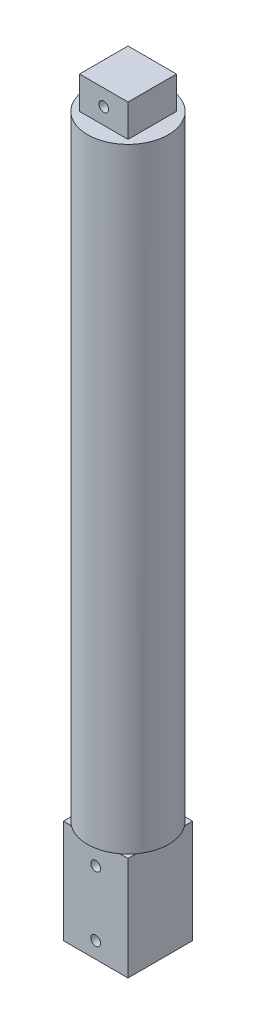
ISO-10303-21;
HEADER;
FILE_DESCRIPTION(('STEP AP214'),'2;1');
FILE_NAME('part.step','',(''),(''),'','','');
FILE_SCHEMA(('AUTOMOTIVE_DESIGN { 1 0 10303 214 1 1 1 1 }'));
ENDSEC;
DATA;
#1=APPLICATION_CONTEXT('core data for automotive mechanical design processes');
#2=APPLICATION_PROTOCOL_DEFINITION('international standard','automotive_design',2000,#1);
#3=PRODUCT_CONTEXT('',#1,'mechanical');
#4=PRODUCT('Part','Part','',(#3));
#5=PRODUCT_RELATED_PRODUCT_CATEGORY('part','',(#4));
#6=PRODUCT_DEFINITION_FORMATION('','',#4);
#7=PRODUCT_DEFINITION_CONTEXT('part definition',#1,'design');
#8=PRODUCT_DEFINITION('design','',#6,#7);
#9=PRODUCT_DEFINITION_SHAPE('','',#8);
#10=(LENGTH_UNIT() NAMED_UNIT(*) SI_UNIT(.MILLI.,.METRE.));
#11=(NAMED_UNIT(*) PLANE_ANGLE_UNIT() SI_UNIT($,.RADIAN.));
#12=(NAMED_UNIT(*) SI_UNIT($,.STERADIAN.) SOLID_ANGLE_UNIT());
#13=UNCERTAINTY_MEASURE_WITH_UNIT(LENGTH_MEASURE(1.E-05),#10,'distance_accuracy_value','');
#14=(GEOMETRIC_REPRESENTATION_CONTEXT(3) GLOBAL_UNCERTAINTY_ASSIGNED_CONTEXT((#13)) GLOBAL_UNIT_ASSIGNED_CONTEXT((#10,
#11,#12)) REPRESENTATION_CONTEXT('',''));
#15=CARTESIAN_POINT('',(0.,0.,0.));
#16=DIRECTION('',(0.,0.,1.));
#17=DIRECTION('',(1.,0.,0.));
#18=AXIS2_PLACEMENT_3D('',#15,#16,#17);
#19=CARTESIAN_POINT('',(0.,232.,0.));
#20=DIRECTION('',(0.,-1.,0.));
#21=DIRECTION('',(0.,0.,-1.));
#22=AXIS2_PLACEMENT_3D('',#19,#20,#21);
#23=CYLINDRICAL_SURFACE('',#22,12.5);
#24=CARTESIAN_POINT('',(0.,32.,0.));
#25=DIRECTION('',(0.,1.,0.));
#26=DIRECTION('',(0.,0.,1.));
#27=AXIS2_PLACEMENT_3D('',#24,#25,#26);
#28=CIRCLE('',#27,12.5);
#29=CARTESIAN_POINT('',(7.5,32.,10.));
#30=VERTEX_POINT('',#29);
#31=CARTESIAN_POINT('',(10.,32.,7.50000000000001));
#32=VERTEX_POINT('',#31);
#33=EDGE_CURVE('E172',#30,#32,#28,.T.);
#34=ORIENTED_EDGE('',*,*,#33,.T.);
#35=CARTESIAN_POINT('',(10.,32.,-7.50000000000001));
#36=VERTEX_POINT('',#35);
#37=EDGE_CURVE('E49',#32,#36,#28,.T.);
#38=ORIENTED_EDGE('',*,*,#37,.T.);
#39=CARTESIAN_POINT('',(7.5,32.,-10.));
#40=VERTEX_POINT('',#39);
#41=EDGE_CURVE('E12',#36,#40,#28,.T.);
#42=ORIENTED_EDGE('',*,*,#41,.T.);
#43=CARTESIAN_POINT('',(-7.5,32.,-10.));
#44=VERTEX_POINT('',#43);
#45=EDGE_CURVE('E236',#40,#44,#28,.T.);
#46=ORIENTED_EDGE('',*,*,#45,.T.);
#47=CARTESIAN_POINT('',(-10.,32.,-7.5));
#48=VERTEX_POINT('',#47);
#49=EDGE_CURVE('E47',#44,#48,#28,.T.);
#50=ORIENTED_EDGE('',*,*,#49,.T.);
#51=CARTESIAN_POINT('',(-10.,32.,7.5));
#52=VERTEX_POINT('',#51);
#53=EDGE_CURVE('E231',#48,#52,#28,.T.);
#54=ORIENTED_EDGE('',*,*,#53,.T.);
#55=CARTESIAN_POINT('',(-7.5,32.,10.));
#56=VERTEX_POINT('',#55);
#57=EDGE_CURVE('E177',#52,#56,#28,.T.);
#58=ORIENTED_EDGE('',*,*,#57,.T.);
#59=EDGE_CURVE('E176',#56,#30,#28,.T.);
#60=ORIENTED_EDGE('',*,*,#59,.T.);
#61=EDGE_LOOP('',(#34,#38,#42,#46,#50,#54,#58,#60));
#62=FACE_BOUND('',#61,.T.);
#63=CARTESIAN_POINT('',(0.,222.,0.));
#64=DIRECTION('',(0.,1.,0.));
#65=DIRECTION('',(0.,0.,1.));
#66=AXIS2_PLACEMENT_3D('',#63,#64,#65);
#67=CIRCLE('',#66,12.5);
#68=CARTESIAN_POINT('',(0.,222.,12.5));
#69=VERTEX_POINT('',#68);
#70=EDGE_CURVE('E169',#69,#69,#67,.T.);
#71=ORIENTED_EDGE('',*,*,#70,.F.);
#72=EDGE_LOOP('',(#71));
#73=FACE_BOUND('',#72,.T.);
#74=ADVANCED_FACE('F38',(#62,#73),#23,.T.);
#75=CARTESIAN_POINT('',(-10.,32.,10.));
#76=DIRECTION('',(0.,-1.,0.));
#77=DIRECTION('',(0.,0.,-1.));
#78=AXIS2_PLACEMENT_3D('',#75,#76,#77);
#79=PLANE('',#78);
#80=ORIENTED_EDGE('',*,*,#33,.F.);
#81=DIRECTION('',(-1.,0.,0.));
#82=VECTOR('',#81,1.);
#83=CARTESIAN_POINT('',(-10.,32.,10.));
#84=LINE('',#83,#82);
#85=CARTESIAN_POINT('',(10.,32.,10.));
#86=VERTEX_POINT('',#85);
#87=EDGE_CURVE('E199',#86,#30,#84,.T.);
#88=ORIENTED_EDGE('',*,*,#87,.F.);
#89=DIRECTION('',(0.,0.,-1.));
#90=VECTOR('',#89,1.);
#91=CARTESIAN_POINT('',(10.,32.,10.));
#92=LINE('',#91,#90);
#93=EDGE_CURVE('E219',#86,#32,#92,.T.);
#94=ORIENTED_EDGE('',*,*,#93,.T.);
#95=EDGE_LOOP('',(#80,#88,#94));
#96=FACE_BOUND('',#95,.T.);
#97=ADVANCED_FACE('F284',(#96),#79,.F.);
#98=ORIENTED_EDGE('',*,*,#41,.F.);
#99=CARTESIAN_POINT('',(10.,32.,-10.));
#100=VERTEX_POINT('',#99);
#101=EDGE_CURVE('E217',#36,#100,#92,.T.);
#102=ORIENTED_EDGE('',*,*,#101,.T.);
#103=DIRECTION('',(-1.,0.,0.));
#104=VECTOR('',#103,1.);
#105=CARTESIAN_POINT('',(-10.,32.,-10.));
#106=LINE('',#105,#104);
#107=EDGE_CURVE('E194',#100,#40,#106,.T.);
#108=ORIENTED_EDGE('',*,*,#107,.T.);
#109=EDGE_LOOP('',(#98,#102,#108));
#110=FACE_BOUND('',#109,.T.);
#111=ADVANCED_FACE('F249',(#110),#79,.F.);
#112=ORIENTED_EDGE('',*,*,#49,.F.);
#113=CARTESIAN_POINT('',(-10.,32.,-10.));
#114=VERTEX_POINT('',#113);
#115=EDGE_CURVE('E211',#44,#114,#106,.T.);
#116=ORIENTED_EDGE('',*,*,#115,.T.);
#117=DIRECTION('',(0.,0.,-1.));
#118=VECTOR('',#117,1.);
#119=CARTESIAN_POINT('',(-10.,32.,10.));
#120=LINE('',#119,#118);
#121=EDGE_CURVE('E202',#48,#114,#120,.T.);
#122=ORIENTED_EDGE('',*,*,#121,.F.);
#123=EDGE_LOOP('',(#112,#116,#122));
#124=FACE_BOUND('',#123,.T.);
#125=ADVANCED_FACE('F264',(#124),#79,.F.);
#126=CARTESIAN_POINT('',(0.,0.,10.));
#127=DIRECTION('',(0.,0.,1.));
#128=DIRECTION('',(1.,0.,0.));
#129=AXIS2_PLACEMENT_3D('',#126,#127,#128);
#130=PLANE('',#129);
#131=CARTESIAN_POINT('',(0.,5.,10.));
#132=DIRECTION('',(0.,0.,1.));
#133=DIRECTION('',(1.,0.,0.));
#134=AXIS2_PLACEMENT_3D('',#131,#132,#133);
#135=CIRCLE('',#134,1.5);
#136=CARTESIAN_POINT('',(1.5,5.,10.));
#137=VERTEX_POINT('',#136);
#138=EDGE_CURVE('E184',#137,#137,#135,.T.);
#139=ORIENTED_EDGE('',*,*,#138,.F.);
#140=EDGE_LOOP('',(#139));
#141=FACE_BOUND('',#140,.T.);
#142=DIRECTION('',(0.,-1.,0.));
#143=VECTOR('',#142,1.);
#144=CARTESIAN_POINT('',(-10.,32.,10.));
#145=LINE('',#144,#143);
#146=CARTESIAN_POINT('',(-10.,32.,10.));
#147=VERTEX_POINT('',#146);
#148=CARTESIAN_POINT('',(-10.,0.,10.));
#149=VERTEX_POINT('',#148);
#150=EDGE_CURVE('E190',#147,#149,#145,.T.);
#151=ORIENTED_EDGE('',*,*,#150,.T.);
#152=DIRECTION('',(1.,0.,0.));
#153=VECTOR('',#152,1.);
#154=CARTESIAN_POINT('',(-10.,0.,10.));
#155=LINE('',#154,#153);
#156=CARTESIAN_POINT('',(10.,0.,10.));
#157=VERTEX_POINT('',#156);
#158=EDGE_CURVE('E193',#149,#157,#155,.T.);
#159=ORIENTED_EDGE('',*,*,#158,.T.);
#160=DIRECTION('',(0.,1.,0.));
#161=VECTOR('',#160,1.);
#162=CARTESIAN_POINT('',(10.,32.,10.));
#163=LINE('',#162,#161);
#164=EDGE_CURVE('E196',#157,#86,#163,.T.);
#165=ORIENTED_EDGE('',*,*,#164,.T.);
#166=ORIENTED_EDGE('',*,*,#87,.T.);
#167=EDGE_CURVE('E203',#30,#56,#84,.T.);
#168=ORIENTED_EDGE('',*,*,#167,.T.);
#169=EDGE_CURVE('E198',#56,#147,#84,.T.);
#170=ORIENTED_EDGE('',*,*,#169,.T.);
#171=EDGE_LOOP('',(#151,#159,#165,#166,#168,#170));
#172=FACE_BOUND('',#171,.T.);
#173=CARTESIAN_POINT('',(0.,25.,10.));
#174=DIRECTION('',(0.,0.,1.));
#175=DIRECTION('',(1.,0.,0.));
#176=AXIS2_PLACEMENT_3D('',#173,#174,#175);
#177=CIRCLE('',#176,1.5);
#178=CARTESIAN_POINT('',(1.5,25.,10.));
#179=VERTEX_POINT('',#178);
#180=EDGE_CURVE('E178',#179,#179,#177,.T.);
#181=ORIENTED_EDGE('',*,*,#180,.F.);
#182=EDGE_LOOP('',(#181));
#183=FACE_BOUND('',#182,.T.);
#184=ADVANCED_FACE('F280',(#141,#172,#183),#130,.T.);
#185=CARTESIAN_POINT('',(0.,0.,-10.));
#186=DIRECTION('',(0.,0.,1.));
#187=DIRECTION('',(1.,0.,0.));
#188=AXIS2_PLACEMENT_3D('',#185,#186,#187);
#189=PLANE('',#188);
#190=DIRECTION('',(0.,-1.,0.));
#191=VECTOR('',#190,1.);
#192=CARTESIAN_POINT('',(-10.,32.,-10.));
#193=LINE('',#192,#191);
#194=CARTESIAN_POINT('',(-10.,0.,-10.));
#195=VERTEX_POINT('',#194);
#196=EDGE_CURVE('E187',#114,#195,#193,.T.);
#197=ORIENTED_EDGE('',*,*,#196,.F.);
#198=ORIENTED_EDGE('',*,*,#115,.F.);
#199=EDGE_CURVE('E213',#40,#44,#106,.T.);
#200=ORIENTED_EDGE('',*,*,#199,.F.);
#201=ORIENTED_EDGE('',*,*,#107,.F.);
#202=DIRECTION('',(0.,1.,0.));
#203=VECTOR('',#202,1.);
#204=CARTESIAN_POINT('',(10.,32.,-10.));
#205=LINE('',#204,#203);
#206=CARTESIAN_POINT('',(10.,0.,-10.));
#207=VERTEX_POINT('',#206);
#208=EDGE_CURVE('E208',#207,#100,#205,.T.);
#209=ORIENTED_EDGE('',*,*,#208,.F.);
#210=DIRECTION('',(1.,0.,0.));
#211=VECTOR('',#210,1.);
#212=CARTESIAN_POINT('',(-10.,0.,-10.));
#213=LINE('',#212,#211);
#214=EDGE_CURVE('E206',#195,#207,#213,.T.);
#215=ORIENTED_EDGE('',*,*,#214,.F.);
#216=EDGE_LOOP('',(#197,#198,#200,#201,#209,#215));
#217=FACE_BOUND('',#216,.T.);
#218=CARTESIAN_POINT('',(0.,5.,-10.));
#219=DIRECTION('',(0.,0.,1.));
#220=DIRECTION('',(1.,0.,0.));
#221=AXIS2_PLACEMENT_3D('',#218,#219,#220);
#222=CIRCLE('',#221,1.5);
#223=CARTESIAN_POINT('',(1.5,5.,-10.));
#224=VERTEX_POINT('',#223);
#225=EDGE_CURVE('E181',#224,#224,#222,.T.);
#226=ORIENTED_EDGE('',*,*,#225,.T.);
#227=EDGE_LOOP('',(#226));
#228=FACE_BOUND('',#227,.T.);
#229=CARTESIAN_POINT('',(0.,25.,-10.));
#230=DIRECTION('',(0.,0.,1.));
#231=DIRECTION('',(1.,0.,0.));
#232=AXIS2_PLACEMENT_3D('',#229,#230,#231);
#233=CIRCLE('',#232,1.5);
#234=CARTESIAN_POINT('',(1.5,25.,-10.));
#235=VERTEX_POINT('',#234);
#236=EDGE_CURVE('E175',#235,#235,#233,.T.);
#237=ORIENTED_EDGE('',*,*,#236,.T.);
#238=EDGE_LOOP('',(#237));
#239=FACE_BOUND('',#238,.T.);
#240=ADVANCED_FACE('F257',(#217,#228,#239),#189,.F.);
#241=CARTESIAN_POINT('',(-10.,32.,10.));
#242=DIRECTION('',(1.,0.,0.));
#243=DIRECTION('',(0.,1.,0.));
#244=AXIS2_PLACEMENT_3D('',#241,#242,#243);
#245=PLANE('',#244);
#246=ORIENTED_EDGE('',*,*,#196,.T.);
#247=DIRECTION('',(0.,0.,-1.));
#248=VECTOR('',#247,1.);
#249=CARTESIAN_POINT('',(-10.,0.,10.));
#250=LINE('',#249,#248);
#251=EDGE_CURVE('E226',#149,#195,#250,.T.);
#252=ORIENTED_EDGE('',*,*,#251,.F.);
#253=ORIENTED_EDGE('',*,*,#150,.F.);
#254=EDGE_CURVE('E214',#147,#52,#120,.T.);
#255=ORIENTED_EDGE('',*,*,#254,.T.);
#256=EDGE_CURVE('E218',#52,#48,#120,.T.);
#257=ORIENTED_EDGE('',*,*,#256,.T.);
#258=ORIENTED_EDGE('',*,*,#121,.T.);
#259=EDGE_LOOP('',(#246,#252,#253,#255,#257,#258));
#260=FACE_BOUND('',#259,.T.);
#261=ADVANCED_FACE('F40',(#260),#245,.F.);
#262=CARTESIAN_POINT('',(-10.,0.,10.));
#263=DIRECTION('',(0.,1.,0.));
#264=DIRECTION('',(-1.,0.,0.));
#265=AXIS2_PLACEMENT_3D('',#262,#263,#264);
#266=PLANE('',#265);
#267=ORIENTED_EDGE('',*,*,#214,.T.);
#268=DIRECTION('',(0.,0.,-1.));
#269=VECTOR('',#268,1.);
#270=CARTESIAN_POINT('',(10.,0.,10.));
#271=LINE('',#270,#269);
#272=EDGE_CURVE('E222',#157,#207,#271,.T.);
#273=ORIENTED_EDGE('',*,*,#272,.F.);
#274=ORIENTED_EDGE('',*,*,#158,.F.);
#275=ORIENTED_EDGE('',*,*,#251,.T.);
#276=EDGE_LOOP('',(#267,#273,#274,#275));
#277=FACE_BOUND('',#276,.T.);
#278=ADVANCED_FACE('F303',(#277),#266,.F.);
#279=CARTESIAN_POINT('',(10.,32.,10.));
#280=DIRECTION('',(-1.,0.,0.));
#281=DIRECTION('',(0.,-1.,0.));
#282=AXIS2_PLACEMENT_3D('',#279,#280,#281);
#283=PLANE('',#282);
#284=ORIENTED_EDGE('',*,*,#208,.T.);
#285=ORIENTED_EDGE('',*,*,#101,.F.);
#286=EDGE_CURVE('E223',#32,#36,#92,.T.);
#287=ORIENTED_EDGE('',*,*,#286,.F.);
#288=ORIENTED_EDGE('',*,*,#93,.F.);
#289=ORIENTED_EDGE('',*,*,#164,.F.);
#290=ORIENTED_EDGE('',*,*,#272,.T.);
#291=EDGE_LOOP('',(#284,#285,#287,#288,#289,#290));
#292=FACE_BOUND('',#291,.T.);
#293=ADVANCED_FACE('F252',(#292),#283,.F.);
#294=ORIENTED_EDGE('',*,*,#57,.F.);
#295=ORIENTED_EDGE('',*,*,#254,.F.);
#296=ORIENTED_EDGE('',*,*,#169,.F.);
#297=EDGE_LOOP('',(#294,#295,#296));
#298=FACE_BOUND('',#297,.T.);
#299=ADVANCED_FACE('F275',(#298),#79,.F.);
#300=CARTESIAN_POINT('',(0.,5.,10.));
#301=DIRECTION('',(0.,0.,-1.));
#302=DIRECTION('',(-1.,0.,0.));
#303=AXIS2_PLACEMENT_3D('',#300,#301,#302);
#304=CYLINDRICAL_SURFACE('',#303,1.5);
#305=ORIENTED_EDGE('',*,*,#138,.T.);
#306=EDGE_LOOP('',(#305));
#307=FACE_BOUND('',#306,.T.);
#308=ORIENTED_EDGE('',*,*,#225,.F.);
#309=EDGE_LOOP('',(#308));
#310=FACE_BOUND('',#309,.T.);
#311=ADVANCED_FACE('F295',(#307,#310),#304,.F.);
#312=CARTESIAN_POINT('',(0.,25.,10.));
#313=DIRECTION('',(0.,0.,-1.));
#314=DIRECTION('',(-1.,0.,0.));
#315=AXIS2_PLACEMENT_3D('',#312,#313,#314);
#316=CYLINDRICAL_SURFACE('',#315,1.5);
#317=ORIENTED_EDGE('',*,*,#180,.T.);
#318=EDGE_LOOP('',(#317));
#319=FACE_BOUND('',#318,.T.);
#320=ORIENTED_EDGE('',*,*,#236,.F.);
#321=EDGE_LOOP('',(#320));
#322=FACE_BOUND('',#321,.T.);
#323=ADVANCED_FACE('F300',(#319,#322),#316,.F.);
#324=CARTESIAN_POINT('',(0.,32.,0.));
#325=DIRECTION('',(0.,1.,0.));
#326=DIRECTION('',(0.,0.,1.));
#327=AXIS2_PLACEMENT_3D('',#324,#325,#326);
#328=PLANE('',#327);
#329=ORIENTED_EDGE('',*,*,#45,.F.);
#330=ORIENTED_EDGE('',*,*,#199,.T.);
#331=EDGE_LOOP('',(#329,#330));
#332=FACE_BOUND('',#331,.T.);
#333=ADVANCED_FACE('F316',(#332),#328,.F.);
#334=ORIENTED_EDGE('',*,*,#256,.F.);
#335=ORIENTED_EDGE('',*,*,#53,.F.);
#336=EDGE_LOOP('',(#334,#335));
#337=FACE_BOUND('',#336,.T.);
#338=ADVANCED_FACE('F272',(#337),#328,.F.);
#339=ORIENTED_EDGE('',*,*,#37,.F.);
#340=ORIENTED_EDGE('',*,*,#286,.T.);
#341=EDGE_LOOP('',(#339,#340));
#342=FACE_BOUND('',#341,.T.);
#343=ADVANCED_FACE('F246',(#342),#328,.F.);
#344=ORIENTED_EDGE('',*,*,#167,.F.);
#345=ORIENTED_EDGE('',*,*,#59,.F.);
#346=EDGE_LOOP('',(#344,#345));
#347=FACE_BOUND('',#346,.T.);
#348=ADVANCED_FACE('F279',(#347),#328,.F.);
#349=CARTESIAN_POINT('',(0.,222.,0.));
#350=DIRECTION('',(0.,1.,0.));
#351=DIRECTION('',(0.,0.,1.));
#352=AXIS2_PLACEMENT_3D('',#349,#350,#351);
#353=PLANE('',#352);
#354=DIRECTION('',(1.,0.,0.));
#355=VECTOR('',#354,1.);
#356=CARTESIAN_POINT('',(-7.5,222.,7.5));
#357=LINE('',#356,#355);
#358=CARTESIAN_POINT('',(-7.5,222.,7.5));
#359=VERTEX_POINT('',#358);
#360=CARTESIAN_POINT('',(7.5,222.,7.5));
#361=VERTEX_POINT('',#360);
#362=EDGE_CURVE('E141',#359,#361,#357,.T.);
#363=ORIENTED_EDGE('',*,*,#362,.F.);
#364=DIRECTION('',(0.,0.,1.));
#365=VECTOR('',#364,1.);
#366=CARTESIAN_POINT('',(-7.5,222.,-7.5));
#367=LINE('',#366,#365);
#368=CARTESIAN_POINT('',(-7.5,222.,-7.5));
#369=VERTEX_POINT('',#368);
#370=EDGE_CURVE('E151',#369,#359,#367,.T.);
#371=ORIENTED_EDGE('',*,*,#370,.F.);
#372=DIRECTION('',(-1.,0.,0.));
#373=VECTOR('',#372,1.);
#374=CARTESIAN_POINT('',(-7.5,222.,-7.5));
#375=LINE('',#374,#373);
#376=CARTESIAN_POINT('',(7.5,222.,-7.5));
#377=VERTEX_POINT('',#376);
#378=EDGE_CURVE('E133',#377,#369,#375,.T.);
#379=ORIENTED_EDGE('',*,*,#378,.F.);
#380=DIRECTION('',(0.,0.,-1.));
#381=VECTOR('',#380,1.);
#382=CARTESIAN_POINT('',(7.5,222.,-7.5));
#383=LINE('',#382,#381);
#384=EDGE_CURVE('E148',#361,#377,#383,.T.);
#385=ORIENTED_EDGE('',*,*,#384,.F.);
#386=EDGE_LOOP('',(#363,#371,#379,#385));
#387=FACE_BOUND('',#386,.T.);
#388=ORIENTED_EDGE('',*,*,#70,.T.);
#389=EDGE_LOOP('',(#388));
#390=FACE_BOUND('',#389,.T.);
#391=ADVANCED_FACE('F146',(#387,#390),#353,.T.);
#392=CARTESIAN_POINT('',(7.5,222.,-7.5));
#393=DIRECTION('',(1.,0.,0.));
#394=DIRECTION('',(0.,0.,-1.));
#395=AXIS2_PLACEMENT_3D('',#392,#393,#394);
#396=PLANE('',#395);
#397=DIRECTION('',(0.,0.,-1.));
#398=VECTOR('',#397,1.);
#399=CARTESIAN_POINT('',(7.5,232.,-7.5));
#400=LINE('',#399,#398);
#401=CARTESIAN_POINT('',(7.5,232.,7.5));
#402=VERTEX_POINT('',#401);
#403=CARTESIAN_POINT('',(7.5,232.,-7.5));
#404=VERTEX_POINT('',#403);
#405=EDGE_CURVE('E164',#402,#404,#400,.T.);
#406=ORIENTED_EDGE('',*,*,#405,.F.);
#407=DIRECTION('',(0.,1.,0.));
#408=VECTOR('',#407,1.);
#409=CARTESIAN_POINT('',(7.5,222.,7.5));
#410=LINE('',#409,#408);
#411=EDGE_CURVE('E154',#361,#402,#410,.T.);
#412=ORIENTED_EDGE('',*,*,#411,.F.);
#413=ORIENTED_EDGE('',*,*,#384,.T.);
#414=DIRECTION('',(0.,1.,0.));
#415=VECTOR('',#414,1.);
#416=CARTESIAN_POINT('',(7.5,222.,-7.5));
#417=LINE('',#416,#415);
#418=EDGE_CURVE('E130',#377,#404,#417,.T.);
#419=ORIENTED_EDGE('',*,*,#418,.T.);
#420=EDGE_LOOP('',(#406,#412,#413,#419));
#421=FACE_BOUND('',#420,.T.);
#422=ADVANCED_FACE('F153',(#421),#396,.T.);
#423=CARTESIAN_POINT('',(-7.5,222.,7.5));
#424=DIRECTION('',(0.,0.,1.));
#425=DIRECTION('',(1.,0.,0.));
#426=AXIS2_PLACEMENT_3D('',#423,#424,#425);
#427=PLANE('',#426);
#428=CARTESIAN_POINT('',(0.,227.,7.5));
#429=DIRECTION('',(0.,0.,1.));
#430=DIRECTION('',(1.,0.,0.));
#431=AXIS2_PLACEMENT_3D('',#428,#429,#430);
#432=CIRCLE('',#431,1.5);
#433=CARTESIAN_POINT('',(1.50000000000001,227.,7.5));
#434=VERTEX_POINT('',#433);
#435=EDGE_CURVE('E160',#434,#434,#432,.T.);
#436=ORIENTED_EDGE('',*,*,#435,.F.);
#437=EDGE_LOOP('',(#436));
#438=FACE_BOUND('',#437,.T.);
#439=DIRECTION('',(1.,0.,0.));
#440=VECTOR('',#439,1.);
#441=CARTESIAN_POINT('',(-7.5,232.,7.5));
#442=LINE('',#441,#440);
#443=CARTESIAN_POINT('',(-7.5,232.,7.5));
#444=VERTEX_POINT('',#443);
#445=EDGE_CURVE('E155',#444,#402,#442,.T.);
#446=ORIENTED_EDGE('',*,*,#445,.F.);
#447=DIRECTION('',(0.,1.,0.));
#448=VECTOR('',#447,1.);
#449=CARTESIAN_POINT('',(-7.5,222.,7.5));
#450=LINE('',#449,#448);
#451=EDGE_CURVE('E170',#359,#444,#450,.T.);
#452=ORIENTED_EDGE('',*,*,#451,.F.);
#453=ORIENTED_EDGE('',*,*,#362,.T.);
#454=ORIENTED_EDGE('',*,*,#411,.T.);
#455=EDGE_LOOP('',(#446,#452,#453,#454));
#456=FACE_BOUND('',#455,.T.);
#457=ADVANCED_FACE('F330',(#438,#456),#427,.T.);
#458=CARTESIAN_POINT('',(-7.5,222.,-7.5));
#459=DIRECTION('',(-1.,0.,0.));
#460=DIRECTION('',(0.,0.,1.));
#461=AXIS2_PLACEMENT_3D('',#458,#459,#460);
#462=PLANE('',#461);
#463=DIRECTION('',(0.,0.,1.));
#464=VECTOR('',#463,1.);
#465=CARTESIAN_POINT('',(-7.5,232.,-7.5));
#466=LINE('',#465,#464);
#467=CARTESIAN_POINT('',(-7.5,232.,-7.5));
#468=VERTEX_POINT('',#467);
#469=EDGE_CURVE('E56',#468,#444,#466,.T.);
#470=ORIENTED_EDGE('',*,*,#469,.F.);
#471=DIRECTION('',(0.,1.,0.));
#472=VECTOR('',#471,1.);
#473=CARTESIAN_POINT('',(-7.5,222.,-7.5));
#474=LINE('',#473,#472);
#475=EDGE_CURVE('E140',#369,#468,#474,.T.);
#476=ORIENTED_EDGE('',*,*,#475,.F.);
#477=ORIENTED_EDGE('',*,*,#370,.T.);
#478=ORIENTED_EDGE('',*,*,#451,.T.);
#479=EDGE_LOOP('',(#470,#476,#477,#478));
#480=FACE_BOUND('',#479,.T.);
#481=ADVANCED_FACE('F333',(#480),#462,.T.);
#482=CARTESIAN_POINT('',(-7.5,222.,-7.5));
#483=DIRECTION('',(0.,0.,-1.));
#484=DIRECTION('',(-1.,0.,0.));
#485=AXIS2_PLACEMENT_3D('',#482,#483,#484);
#486=PLANE('',#485);
#487=CARTESIAN_POINT('',(0.,227.,-7.5));
#488=DIRECTION('',(0.,0.,-1.));
#489=DIRECTION('',(-1.,0.,0.));
#490=AXIS2_PLACEMENT_3D('',#487,#488,#489);
#491=CIRCLE('',#490,1.5);
#492=CARTESIAN_POINT('',(-1.5,227.,-7.5));
#493=VERTEX_POINT('',#492);
#494=EDGE_CURVE('E42',#493,#493,#491,.T.);
#495=ORIENTED_EDGE('',*,*,#494,.F.);
#496=EDGE_LOOP('',(#495));
#497=FACE_BOUND('',#496,.T.);
#498=DIRECTION('',(-1.,0.,0.));
#499=VECTOR('',#498,1.);
#500=CARTESIAN_POINT('',(-7.5,232.,-7.5));
#501=LINE('',#500,#499);
#502=EDGE_CURVE('E135',#404,#468,#501,.T.);
#503=ORIENTED_EDGE('',*,*,#502,.F.);
#504=ORIENTED_EDGE('',*,*,#418,.F.);
#505=ORIENTED_EDGE('',*,*,#378,.T.);
#506=ORIENTED_EDGE('',*,*,#475,.T.);
#507=EDGE_LOOP('',(#503,#504,#505,#506));
#508=FACE_BOUND('',#507,.T.);
#509=ADVANCED_FACE('F132',(#497,#508),#486,.T.);
#510=CARTESIAN_POINT('',(0.,232.,0.));
#511=DIRECTION('',(0.,1.,0.));
#512=DIRECTION('',(0.,0.,1.));
#513=AXIS2_PLACEMENT_3D('',#510,#511,#512);
#514=PLANE('',#513);
#515=ORIENTED_EDGE('',*,*,#445,.T.);
#516=ORIENTED_EDGE('',*,*,#405,.T.);
#517=ORIENTED_EDGE('',*,*,#502,.T.);
#518=ORIENTED_EDGE('',*,*,#469,.T.);
#519=EDGE_LOOP('',(#515,#516,#517,#518));
#520=FACE_BOUND('',#519,.T.);
#521=ADVANCED_FACE('F321',(#520),#514,.T.);
#522=CARTESIAN_POINT('',(0.,227.,-12.5));
#523=DIRECTION('',(0.,0.,1.));
#524=DIRECTION('',(1.,0.,0.));
#525=AXIS2_PLACEMENT_3D('',#522,#523,#524);
#526=CYLINDRICAL_SURFACE('',#525,1.5);
#527=ORIENTED_EDGE('',*,*,#494,.T.);
#528=EDGE_LOOP('',(#527));
#529=FACE_BOUND('',#528,.T.);
#530=ORIENTED_EDGE('',*,*,#435,.T.);
#531=EDGE_LOOP('',(#530));
#532=FACE_BOUND('',#531,.T.);
#533=ADVANCED_FACE('F324',(#529,#532),#526,.F.);
#534=CLOSED_SHELL('',(#74,#97,#111,#125,#184,#240,#261,#278,#293,#299,#311,#323,#333,#338,#343,
#348,#391,#422,#457,#481,#509,#521,#533));
#535=MANIFOLD_SOLID_BREP('B2',#534);
#536=ADVANCED_BREP_SHAPE_REPRESENTATION('',(#18,#535),#14);
#537=SHAPE_DEFINITION_REPRESENTATION(#9,#536);
ENDSEC;
END-ISO-10303-21;
